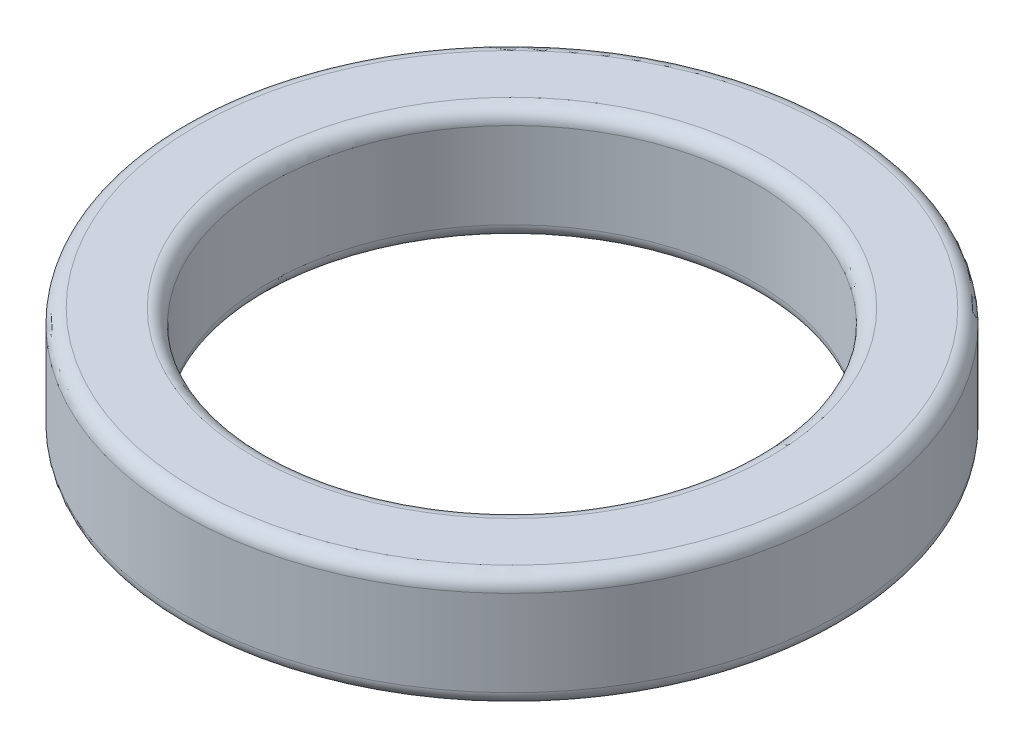
ISO-10303-21;
HEADER;
FILE_DESCRIPTION(('STEP AP214'),'2;1');
FILE_NAME('part.step','',(''),(''),'','','');
FILE_SCHEMA(('AUTOMOTIVE_DESIGN { 1 0 10303 214 1 1 1 1 }'));
ENDSEC;
DATA;
#1=APPLICATION_CONTEXT('core data for automotive mechanical design processes');
#2=APPLICATION_PROTOCOL_DEFINITION('international standard','automotive_design',2000,#1);
#3=PRODUCT_CONTEXT('',#1,'mechanical');
#4=PRODUCT('Part','Part','',(#3));
#5=PRODUCT_RELATED_PRODUCT_CATEGORY('part','',(#4));
#6=PRODUCT_DEFINITION_FORMATION('','',#4);
#7=PRODUCT_DEFINITION_CONTEXT('part definition',#1,'design');
#8=PRODUCT_DEFINITION('design','',#6,#7);
#9=PRODUCT_DEFINITION_SHAPE('','',#8);
#10=(LENGTH_UNIT() NAMED_UNIT(*) SI_UNIT(.MILLI.,.METRE.));
#11=(NAMED_UNIT(*) PLANE_ANGLE_UNIT() SI_UNIT($,.RADIAN.));
#12=(NAMED_UNIT(*) SI_UNIT($,.STERADIAN.) SOLID_ANGLE_UNIT());
#13=UNCERTAINTY_MEASURE_WITH_UNIT(LENGTH_MEASURE(1.E-05),#10,'distance_accuracy_value','');
#14=(GEOMETRIC_REPRESENTATION_CONTEXT(3) GLOBAL_UNCERTAINTY_ASSIGNED_CONTEXT((#13)) GLOBAL_UNIT_ASSIGNED_CONTEXT((#10,
#11,#12)) REPRESENTATION_CONTEXT('',''));
#15=CARTESIAN_POINT('',(0.,0.,0.));
#16=DIRECTION('',(0.,0.,1.));
#17=DIRECTION('',(1.,0.,0.));
#18=AXIS2_PLACEMENT_3D('',#15,#16,#17);
#19=CARTESIAN_POINT('',(0.,4.,0.));
#20=DIRECTION('',(0.,1.,0.));
#21=DIRECTION('',(0.,0.,1.));
#22=AXIS2_PLACEMENT_3D('',#19,#20,#21);
#23=PLANE('',#22);
#24=CARTESIAN_POINT('',(0.,4.,0.));
#25=DIRECTION('',(0.,1.,0.));
#26=DIRECTION('',(0.,0.,1.));
#27=AXIS2_PLACEMENT_3D('',#24,#25,#26);
#28=CIRCLE('',#27,9.);
#29=CARTESIAN_POINT('',(0.,4.,9.));
#30=VERTEX_POINT('',#29);
#31=EDGE_CURVE('E10',#30,#30,#28,.F.);
#32=ORIENTED_EDGE('',*,*,#31,.T.);
#33=EDGE_LOOP('',(#32));
#34=FACE_BOUND('',#33,.T.);
#35=CARTESIAN_POINT('',(0.,4.,0.));
#36=DIRECTION('',(0.,1.,0.));
#37=DIRECTION('',(0.,0.,1.));
#38=AXIS2_PLACEMENT_3D('',#35,#36,#37);
#39=CIRCLE('',#38,11.);
#40=CARTESIAN_POINT('',(0.,4.,11.));
#41=VERTEX_POINT('',#40);
#42=EDGE_CURVE('E42',#41,#41,#39,.T.);
#43=ORIENTED_EDGE('',*,*,#42,.T.);
#44=EDGE_LOOP('',(#43));
#45=FACE_BOUND('',#44,.T.);
#46=ADVANCED_FACE('F40',(#34,#45),#23,.T.);
#47=CARTESIAN_POINT('',(0.,0.,0.));
#48=DIRECTION('',(0.,1.,0.));
#49=DIRECTION('',(0.,0.,1.));
#50=AXIS2_PLACEMENT_3D('',#47,#48,#49);
#51=PLANE('',#50);
#52=CARTESIAN_POINT('',(0.,0.,0.));
#53=DIRECTION('',(0.,1.,0.));
#54=DIRECTION('',(0.,0.,1.));
#55=AXIS2_PLACEMENT_3D('',#52,#53,#54);
#56=CIRCLE('',#55,11.);
#57=CARTESIAN_POINT('',(0.,0.,11.));
#58=VERTEX_POINT('',#57);
#59=EDGE_CURVE('E60',#58,#58,#56,.F.);
#60=ORIENTED_EDGE('',*,*,#59,.T.);
#61=EDGE_LOOP('',(#60));
#62=FACE_BOUND('',#61,.T.);
#63=CARTESIAN_POINT('',(0.,0.,0.));
#64=DIRECTION('',(0.,1.,0.));
#65=DIRECTION('',(0.,0.,1.));
#66=AXIS2_PLACEMENT_3D('',#63,#64,#65);
#67=CIRCLE('',#66,9.);
#68=CARTESIAN_POINT('',(0.,0.,9.));
#69=VERTEX_POINT('',#68);
#70=EDGE_CURVE('E58',#69,#69,#67,.T.);
#71=ORIENTED_EDGE('',*,*,#70,.T.);
#72=EDGE_LOOP('',(#71));
#73=FACE_BOUND('',#72,.T.);
#74=ADVANCED_FACE('F81',(#62,#73),#51,.F.);
#75=CARTESIAN_POINT('',(0.,4.,0.));
#76=DIRECTION('',(0.,-1.,0.));
#77=DIRECTION('',(0.,0.,-1.));
#78=AXIS2_PLACEMENT_3D('',#75,#76,#77);
#79=CYLINDRICAL_SURFACE('',#78,11.5);
#80=CARTESIAN_POINT('',(0.,0.5,0.));
#81=DIRECTION('',(0.,1.,0.));
#82=DIRECTION('',(0.,0.,1.));
#83=AXIS2_PLACEMENT_3D('',#80,#81,#82);
#84=CIRCLE('',#83,11.5);
#85=CARTESIAN_POINT('',(0.,0.5,11.5));
#86=VERTEX_POINT('',#85);
#87=EDGE_CURVE('E64',#86,#86,#84,.T.);
#88=ORIENTED_EDGE('',*,*,#87,.T.);
#89=EDGE_LOOP('',(#88));
#90=FACE_BOUND('',#89,.T.);
#91=CARTESIAN_POINT('',(0.,3.5,0.));
#92=DIRECTION('',(0.,1.,0.));
#93=DIRECTION('',(0.,0.,1.));
#94=AXIS2_PLACEMENT_3D('',#91,#92,#93);
#95=CIRCLE('',#94,11.5);
#96=CARTESIAN_POINT('',(0.,3.5,11.5));
#97=VERTEX_POINT('',#96);
#98=EDGE_CURVE('E68',#97,#97,#95,.F.);
#99=ORIENTED_EDGE('',*,*,#98,.T.);
#100=EDGE_LOOP('',(#99));
#101=FACE_BOUND('',#100,.T.);
#102=ADVANCED_FACE('F66',(#90,#101),#79,.T.);
#103=CARTESIAN_POINT('',(0.,4.,0.));
#104=DIRECTION('',(0.,-1.,0.));
#105=DIRECTION('',(0.,0.,-1.));
#106=AXIS2_PLACEMENT_3D('',#103,#104,#105);
#107=CYLINDRICAL_SURFACE('',#106,8.5);
#108=CARTESIAN_POINT('',(0.,0.5,0.));
#109=DIRECTION('',(0.,1.,0.));
#110=DIRECTION('',(0.,0.,1.));
#111=AXIS2_PLACEMENT_3D('',#108,#109,#110);
#112=CIRCLE('',#111,8.5);
#113=CARTESIAN_POINT('',(0.,0.5,8.5));
#114=VERTEX_POINT('',#113);
#115=EDGE_CURVE('E48',#114,#114,#112,.F.);
#116=ORIENTED_EDGE('',*,*,#115,.T.);
#117=EDGE_LOOP('',(#116));
#118=FACE_BOUND('',#117,.T.);
#119=CARTESIAN_POINT('',(0.,3.5,0.));
#120=DIRECTION('',(0.,1.,0.));
#121=DIRECTION('',(0.,0.,1.));
#122=AXIS2_PLACEMENT_3D('',#119,#120,#121);
#123=CIRCLE('',#122,8.5);
#124=CARTESIAN_POINT('',(0.,3.5,8.5));
#125=VERTEX_POINT('',#124);
#126=EDGE_CURVE('E55',#125,#125,#123,.T.);
#127=ORIENTED_EDGE('',*,*,#126,.T.);
#128=EDGE_LOOP('',(#127));
#129=FACE_BOUND('',#128,.T.);
#130=ADVANCED_FACE('F90',(#118,#129),#107,.F.);
#131=CARTESIAN_POINT('',(0.,0.5,0.));
#132=DIRECTION('',(0.,1.,0.));
#133=DIRECTION('',(0.,0.,1.));
#134=AXIS2_PLACEMENT_3D('',#131,#132,#133);
#135=TOROIDAL_SURFACE('',#134,11.,0.5);
#136=ORIENTED_EDGE('',*,*,#59,.F.);
#137=EDGE_LOOP('',(#136));
#138=FACE_BOUND('',#137,.T.);
#139=ORIENTED_EDGE('',*,*,#87,.F.);
#140=EDGE_LOOP('',(#139));
#141=FACE_BOUND('',#140,.T.);
#142=ADVANCED_FACE('F92',(#138,#141),#135,.T.);
#143=CARTESIAN_POINT('',(0.,0.5,0.));
#144=DIRECTION('',(0.,1.,0.));
#145=DIRECTION('',(0.,0.,1.));
#146=AXIS2_PLACEMENT_3D('',#143,#144,#145);
#147=TOROIDAL_SURFACE('',#146,9.,0.5);
#148=ORIENTED_EDGE('',*,*,#115,.F.);
#149=EDGE_LOOP('',(#148));
#150=FACE_BOUND('',#149,.T.);
#151=ORIENTED_EDGE('',*,*,#70,.F.);
#152=EDGE_LOOP('',(#151));
#153=FACE_BOUND('',#152,.T.);
#154=ADVANCED_FACE('F76',(#150,#153),#147,.T.);
#155=CARTESIAN_POINT('',(0.,3.5,0.));
#156=DIRECTION('',(0.,1.,0.));
#157=DIRECTION('',(0.,0.,1.));
#158=AXIS2_PLACEMENT_3D('',#155,#156,#157);
#159=TOROIDAL_SURFACE('',#158,9.,0.5);
#160=ORIENTED_EDGE('',*,*,#31,.F.);
#161=EDGE_LOOP('',(#160));
#162=FACE_BOUND('',#161,.T.);
#163=ORIENTED_EDGE('',*,*,#126,.F.);
#164=EDGE_LOOP('',(#163));
#165=FACE_BOUND('',#164,.T.);
#166=ADVANCED_FACE('F72',(#162,#165),#159,.T.);
#167=CARTESIAN_POINT('',(0.,3.5,0.));
#168=DIRECTION('',(0.,1.,0.));
#169=DIRECTION('',(0.,0.,1.));
#170=AXIS2_PLACEMENT_3D('',#167,#168,#169);
#171=TOROIDAL_SURFACE('',#170,11.,0.5);
#172=ORIENTED_EDGE('',*,*,#98,.F.);
#173=EDGE_LOOP('',(#172));
#174=FACE_BOUND('',#173,.T.);
#175=ORIENTED_EDGE('',*,*,#42,.F.);
#176=EDGE_LOOP('',(#175));
#177=FACE_BOUND('',#176,.T.);
#178=ADVANCED_FACE('F39',(#174,#177),#171,.T.);
#179=CLOSED_SHELL('',(#46,#74,#102,#130,#142,#154,#166,#178));
#180=MANIFOLD_SOLID_BREP('B2',#179);
#181=ADVANCED_BREP_SHAPE_REPRESENTATION('',(#18,#180),#14);
#182=SHAPE_DEFINITION_REPRESENTATION(#9,#181);
ENDSEC;
END-ISO-10303-21;
